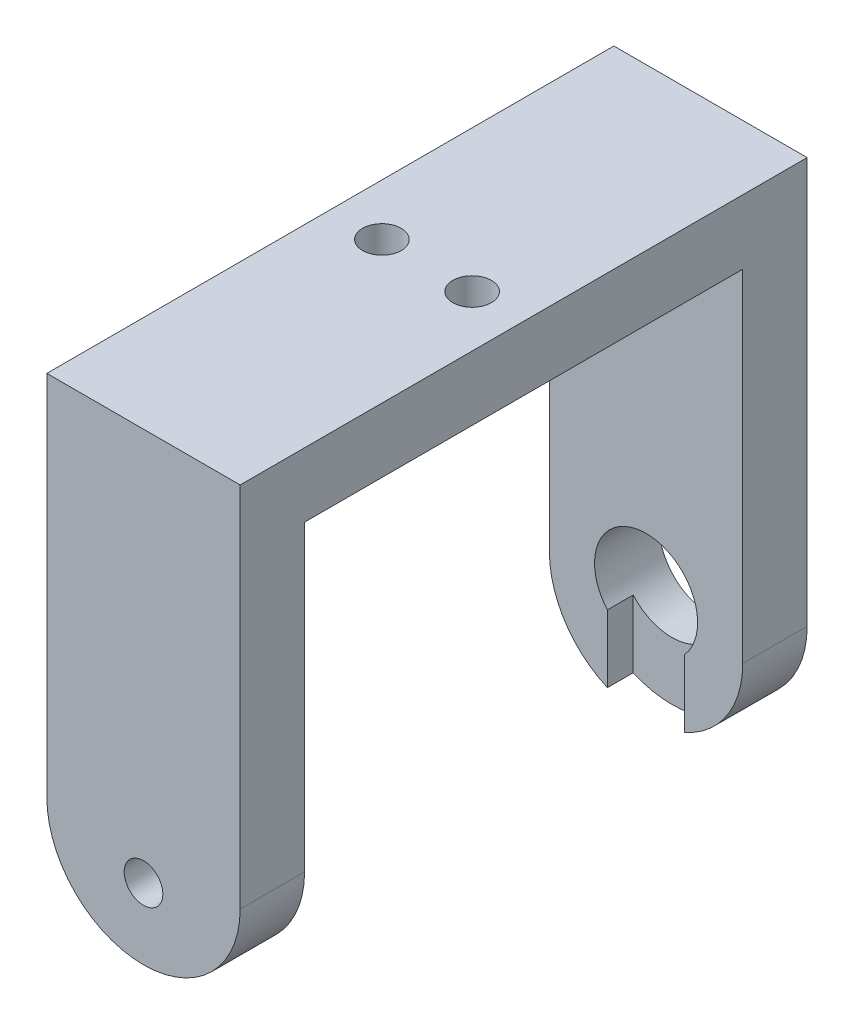
ISO-10303-21;
HEADER;
FILE_DESCRIPTION(('STEP AP214'),'2;1');
FILE_NAME('part.step','',(''),(''),'','','');
FILE_SCHEMA(('AUTOMOTIVE_DESIGN { 1 0 10303 214 1 1 1 1 }'));
ENDSEC;
DATA;
#1=APPLICATION_CONTEXT('core data for automotive mechanical design processes');
#2=APPLICATION_PROTOCOL_DEFINITION('international standard','automotive_design',2000,#1);
#3=PRODUCT_CONTEXT('',#1,'mechanical');
#4=PRODUCT('Part','Part','',(#3));
#5=PRODUCT_RELATED_PRODUCT_CATEGORY('part','',(#4));
#6=PRODUCT_DEFINITION_FORMATION('','',#4);
#7=PRODUCT_DEFINITION_CONTEXT('part definition',#1,'design');
#8=PRODUCT_DEFINITION('design','',#6,#7);
#9=PRODUCT_DEFINITION_SHAPE('','',#8);
#10=(LENGTH_UNIT() NAMED_UNIT(*) SI_UNIT(.MILLI.,.METRE.));
#11=(NAMED_UNIT(*) PLANE_ANGLE_UNIT() SI_UNIT($,.RADIAN.));
#12=(NAMED_UNIT(*) SI_UNIT($,.STERADIAN.) SOLID_ANGLE_UNIT());
#13=UNCERTAINTY_MEASURE_WITH_UNIT(LENGTH_MEASURE(1.E-05),#10,'distance_accuracy_value','');
#14=(GEOMETRIC_REPRESENTATION_CONTEXT(3) GLOBAL_UNCERTAINTY_ASSIGNED_CONTEXT((#13)) GLOBAL_UNIT_ASSIGNED_CONTEXT((#10,
#11,#12)) REPRESENTATION_CONTEXT('',''));
#15=CARTESIAN_POINT('',(0.,0.,0.));
#16=DIRECTION('',(0.,0.,1.));
#17=DIRECTION('',(1.,0.,0.));
#18=AXIS2_PLACEMENT_3D('',#15,#16,#17);
#19=CARTESIAN_POINT('',(-7.5,-5.,-22.));
#20=DIRECTION('',(0.,0.,-1.));
#21=DIRECTION('',(-1.,0.,0.));
#22=AXIS2_PLACEMENT_3D('',#19,#20,#21);
#23=PLANE('',#22);
#24=DIRECTION('',(0.,1.,0.));
#25=VECTOR('',#24,1.);
#26=CARTESIAN_POINT('',(7.5,-5.,-22.));
#27=LINE('',#26,#25);
#28=CARTESIAN_POINT('',(7.5,-31.5,-22.));
#29=VERTEX_POINT('',#28);
#30=CARTESIAN_POINT('',(7.5,0.,-22.));
#31=VERTEX_POINT('',#30);
#32=EDGE_CURVE('E360',#29,#31,#27,.T.);
#33=ORIENTED_EDGE('',*,*,#32,.F.);
#34=CARTESIAN_POINT('',(0.,-31.5,-22.));
#35=DIRECTION('',(0.,0.,-1.));
#36=DIRECTION('',(-1.,0.,0.));
#37=AXIS2_PLACEMENT_3D('',#34,#35,#36);
#38=CIRCLE('',#37,7.5);
#39=CARTESIAN_POINT('',(-7.5,-31.5,-22.));
#40=VERTEX_POINT('',#39);
#41=EDGE_CURVE('E298',#29,#40,#38,.T.);
#42=ORIENTED_EDGE('',*,*,#41,.T.);
#43=DIRECTION('',(0.,1.,0.));
#44=VECTOR('',#43,1.);
#45=CARTESIAN_POINT('',(-7.5,-5.,-22.));
#46=LINE('',#45,#44);
#47=CARTESIAN_POINT('',(-7.5,0.,-22.));
#48=VERTEX_POINT('',#47);
#49=EDGE_CURVE('E374',#40,#48,#46,.T.);
#50=ORIENTED_EDGE('',*,*,#49,.T.);
#51=DIRECTION('',(-1.,0.,0.));
#52=VECTOR('',#51,1.);
#53=CARTESIAN_POINT('',(-7.5,0.,-22.));
#54=LINE('',#53,#52);
#55=EDGE_CURVE('E363',#31,#48,#54,.T.);
#56=ORIENTED_EDGE('',*,*,#55,.F.);
#57=EDGE_LOOP('',(#33,#42,#50,#56));
#58=FACE_BOUND('',#57,.T.);
#59=DIRECTION('',(-1.,0.,0.));
#60=VECTOR('',#59,1.);
#61=CARTESIAN_POINT('',(0.,-10.5,-22.));
#62=LINE('',#61,#60);
#63=CARTESIAN_POINT('',(2.125,-10.5,-22.));
#64=VERTEX_POINT('',#63);
#65=CARTESIAN_POINT('',(-2.125,-10.5,-22.));
#66=VERTEX_POINT('',#65);
#67=EDGE_CURVE('E259',#64,#66,#62,.T.);
#68=ORIENTED_EDGE('',*,*,#67,.T.);
#69=DIRECTION('',(-0.0741895147875681,-0.997244160622455,0.));
#70=VECTOR('',#69,1.);
#71=CARTESIAN_POINT('',(-1.33646068706431,0.0994253702564403,-22.));
#72=LINE('',#71,#70);
#73=CARTESIAN_POINT('',(-3.46410161513776,-28.5,-22.));
#74=VERTEX_POINT('',#73);
#75=EDGE_CURVE('E250',#66,#74,#72,.T.);
#76=ORIENTED_EDGE('',*,*,#75,.T.);
#77=CARTESIAN_POINT('',(0.,-30.5,-22.));
#78=DIRECTION('',(0.,0.,-1.));
#79=DIRECTION('',(-1.,0.,0.));
#80=AXIS2_PLACEMENT_3D('',#77,#78,#79);
#81=CIRCLE('',#80,4.);
#82=CARTESIAN_POINT('',(3.46410161513776,-28.5,-22.));
#83=VERTEX_POINT('',#82);
#84=EDGE_CURVE('E303',#83,#74,#81,.T.);
#85=ORIENTED_EDGE('',*,*,#84,.F.);
#86=DIRECTION('',(0.0741895147875681,-0.997244160622455,0.));
#87=VECTOR('',#86,1.);
#88=CARTESIAN_POINT('',(1.33646068706431,0.0994253702564403,-22.));
#89=LINE('',#88,#87);
#90=EDGE_CURVE('E257',#64,#83,#89,.T.);
#91=ORIENTED_EDGE('',*,*,#90,.F.);
#92=EDGE_LOOP('',(#68,#76,#85,#91));
#93=FACE_BOUND('',#92,.T.);
#94=ADVANCED_FACE('F124',(#58,#93),#23,.T.);
#95=CARTESIAN_POINT('',(0.,-30.5,22.001));
#96=DIRECTION('',(0.,0.,-1.));
#97=DIRECTION('',(-1.,0.,0.));
#98=AXIS2_PLACEMENT_3D('',#95,#96,#97);
#99=CYLINDRICAL_SURFACE('',#98,4.);
#100=CARTESIAN_POINT('',(0.,-30.5,-17.));
#101=DIRECTION('',(0.,0.,-1.));
#102=DIRECTION('',(-1.,0.,0.));
#103=AXIS2_PLACEMENT_3D('',#100,#101,#102);
#104=CIRCLE('',#103,4.);
#105=CARTESIAN_POINT('',(3.,-33.1457513110646,-17.));
#106=VERTEX_POINT('',#105);
#107=CARTESIAN_POINT('',(-3.,-33.1457513110646,-17.));
#108=VERTEX_POINT('',#107);
#109=EDGE_CURVE('E306',#106,#108,#104,.F.);
#110=ORIENTED_EDGE('',*,*,#109,.T.);
#111=DIRECTION('',(0.,0.,1.));
#112=VECTOR('',#111,1.);
#113=CARTESIAN_POINT('',(-3.,-33.1457513110646,-19.));
#114=LINE('',#113,#112);
#115=CARTESIAN_POINT('',(-3.,-33.1457513110646,-19.));
#116=VERTEX_POINT('',#115);
#117=EDGE_CURVE('E281',#116,#108,#114,.T.);
#118=ORIENTED_EDGE('',*,*,#117,.F.);
#119=CARTESIAN_POINT('',(0.,-30.5,-19.));
#120=DIRECTION('',(0.,0.,1.));
#121=DIRECTION('',(1.,0.,0.));
#122=AXIS2_PLACEMENT_3D('',#119,#120,#121);
#123=CIRCLE('',#122,4.);
#124=CARTESIAN_POINT('',(3.,-33.1457513110646,-19.));
#125=VERTEX_POINT('',#124);
#126=EDGE_CURVE('E12',#125,#116,#123,.F.);
#127=ORIENTED_EDGE('',*,*,#126,.F.);
#128=DIRECTION('',(0.,0.,1.));
#129=VECTOR('',#128,1.);
#130=CARTESIAN_POINT('',(3.,-33.1457513110646,-19.));
#131=LINE('',#130,#129);
#132=EDGE_CURVE('E147',#125,#106,#131,.T.);
#133=ORIENTED_EDGE('',*,*,#132,.T.);
#134=EDGE_LOOP('',(#110,#118,#127,#133));
#135=FACE_BOUND('',#134,.T.);
#136=DIRECTION('',(0.,0.,-1.));
#137=VECTOR('',#136,1.);
#138=CARTESIAN_POINT('',(-3.46410161513776,-28.5,-19.));
#139=LINE('',#138,#137);
#140=CARTESIAN_POINT('',(-3.46410161513776,-28.5,-19.));
#141=VERTEX_POINT('',#140);
#142=EDGE_CURVE('E266',#141,#74,#139,.T.);
#143=ORIENTED_EDGE('',*,*,#142,.F.);
#144=CARTESIAN_POINT('',(0.,-30.5,-19.));
#145=DIRECTION('',(0.,0.,-1.));
#146=DIRECTION('',(-1.,0.,0.));
#147=AXIS2_PLACEMENT_3D('',#144,#145,#146);
#148=CIRCLE('',#147,4.);
#149=CARTESIAN_POINT('',(3.46410161513776,-28.5,-19.));
#150=VERTEX_POINT('',#149);
#151=EDGE_CURVE('E252',#150,#141,#148,.F.);
#152=ORIENTED_EDGE('',*,*,#151,.F.);
#153=DIRECTION('',(0.,0.,-1.));
#154=VECTOR('',#153,1.);
#155=CARTESIAN_POINT('',(3.46410161513776,-28.5,-19.));
#156=LINE('',#155,#154);
#157=EDGE_CURVE('E269',#150,#83,#156,.T.);
#158=ORIENTED_EDGE('',*,*,#157,.T.);
#159=ORIENTED_EDGE('',*,*,#84,.T.);
#160=EDGE_LOOP('',(#143,#152,#158,#159));
#161=FACE_BOUND('',#160,.T.);
#162=ADVANCED_FACE('F433',(#135,#161),#99,.F.);
#163=CARTESIAN_POINT('',(7.5,-39.,-17.));
#164=DIRECTION('',(0.,0.,-1.));
#165=DIRECTION('',(-1.,0.,0.));
#166=AXIS2_PLACEMENT_3D('',#163,#164,#165);
#167=PLANE('',#166);
#168=CARTESIAN_POINT('',(0.,-31.5,-17.));
#169=DIRECTION('',(0.,0.,-1.));
#170=DIRECTION('',(-1.,0.,0.));
#171=AXIS2_PLACEMENT_3D('',#168,#169,#170);
#172=CIRCLE('',#171,7.5);
#173=CARTESIAN_POINT('',(-7.5,-31.5,-17.));
#174=VERTEX_POINT('',#173);
#175=CARTESIAN_POINT('',(-3.,-38.3738635424338,-17.));
#176=VERTEX_POINT('',#175);
#177=EDGE_CURVE('E295',#174,#176,#172,.F.);
#178=ORIENTED_EDGE('',*,*,#177,.T.);
#179=DIRECTION('',(0.,-1.,0.));
#180=VECTOR('',#179,1.);
#181=CARTESIAN_POINT('',(-3.,-33.1457513110646,-17.));
#182=LINE('',#181,#180);
#183=EDGE_CURVE('E268',#108,#176,#182,.T.);
#184=ORIENTED_EDGE('',*,*,#183,.F.);
#185=ORIENTED_EDGE('',*,*,#109,.F.);
#186=DIRECTION('',(0.,1.,0.));
#187=VECTOR('',#186,1.);
#188=CARTESIAN_POINT('',(3.,-33.1457513110646,-17.));
#189=LINE('',#188,#187);
#190=CARTESIAN_POINT('',(3.,-38.3738635424338,-17.));
#191=VERTEX_POINT('',#190);
#192=EDGE_CURVE('E277',#191,#106,#189,.T.);
#193=ORIENTED_EDGE('',*,*,#192,.F.);
#194=CARTESIAN_POINT('',(7.5,-31.5,-17.));
#195=VERTEX_POINT('',#194);
#196=EDGE_CURVE('E294',#191,#195,#172,.F.);
#197=ORIENTED_EDGE('',*,*,#196,.T.);
#198=DIRECTION('',(0.,1.,0.));
#199=VECTOR('',#198,1.);
#200=CARTESIAN_POINT('',(7.5,-39.,-17.));
#201=LINE('',#200,#199);
#202=CARTESIAN_POINT('',(7.5,-5.,-17.));
#203=VERTEX_POINT('',#202);
#204=EDGE_CURVE('E336',#195,#203,#201,.T.);
#205=ORIENTED_EDGE('',*,*,#204,.T.);
#206=DIRECTION('',(-1.,0.,0.));
#207=VECTOR('',#206,1.);
#208=CARTESIAN_POINT('',(7.5,-5.,-17.));
#209=LINE('',#208,#207);
#210=CARTESIAN_POINT('',(-7.5,-5.,-17.));
#211=VERTEX_POINT('',#210);
#212=EDGE_CURVE('E333',#203,#211,#209,.T.);
#213=ORIENTED_EDGE('',*,*,#212,.T.);
#214=DIRECTION('',(0.,1.,0.));
#215=VECTOR('',#214,1.);
#216=CARTESIAN_POINT('',(-7.5,-39.,-17.));
#217=LINE('',#216,#215);
#218=EDGE_CURVE('E338',#174,#211,#217,.T.);
#219=ORIENTED_EDGE('',*,*,#218,.F.);
#220=EDGE_LOOP('',(#178,#184,#185,#193,#197,#205,#213,#219));
#221=FACE_BOUND('',#220,.T.);
#222=ADVANCED_FACE('F405',(#221),#167,.F.);
#223=CARTESIAN_POINT('',(7.5,-5.,22.));
#224=DIRECTION('',(1.,0.,0.));
#225=DIRECTION('',(0.,0.,-1.));
#226=AXIS2_PLACEMENT_3D('',#223,#224,#225);
#227=PLANE('',#226);
#228=ORIENTED_EDGE('',*,*,#204,.F.);
#229=DIRECTION('',(0.,0.,-1.));
#230=VECTOR('',#229,1.);
#231=CARTESIAN_POINT('',(7.5,-31.5,22.001));
#232=LINE('',#231,#230);
#233=EDGE_CURVE('E291',#195,#29,#232,.T.);
#234=ORIENTED_EDGE('',*,*,#233,.T.);
#235=ORIENTED_EDGE('',*,*,#32,.T.);
#236=DIRECTION('',(0.,0.,-1.));
#237=VECTOR('',#236,1.);
#238=CARTESIAN_POINT('',(7.5,0.,22.));
#239=LINE('',#238,#237);
#240=CARTESIAN_POINT('',(7.5,0.,22.));
#241=VERTEX_POINT('',#240);
#242=EDGE_CURVE('E350',#241,#31,#239,.T.);
#243=ORIENTED_EDGE('',*,*,#242,.F.);
#244=DIRECTION('',(0.,1.,0.));
#245=VECTOR('',#244,1.);
#246=CARTESIAN_POINT('',(7.5,-5.,22.));
#247=LINE('',#246,#245);
#248=CARTESIAN_POINT('',(7.5,-28.5,22.));
#249=VERTEX_POINT('',#248);
#250=EDGE_CURVE('E132',#249,#241,#247,.T.);
#251=ORIENTED_EDGE('',*,*,#250,.F.);
#252=DIRECTION('',(0.,0.,1.));
#253=VECTOR('',#252,1.);
#254=CARTESIAN_POINT('',(7.5,-28.5,-22.001));
#255=LINE('',#254,#253);
#256=CARTESIAN_POINT('',(7.5,-28.5,17.));
#257=VERTEX_POINT('',#256);
#258=EDGE_CURVE('E309',#257,#249,#255,.T.);
#259=ORIENTED_EDGE('',*,*,#258,.F.);
#260=DIRECTION('',(0.,1.,0.));
#261=VECTOR('',#260,1.);
#262=CARTESIAN_POINT('',(7.5,-36.,17.));
#263=LINE('',#262,#261);
#264=CARTESIAN_POINT('',(7.5,-5.,17.));
#265=VERTEX_POINT('',#264);
#266=EDGE_CURVE('E329',#257,#265,#263,.T.);
#267=ORIENTED_EDGE('',*,*,#266,.T.);
#268=DIRECTION('',(0.,0.,-1.));
#269=VECTOR('',#268,1.);
#270=CARTESIAN_POINT('',(7.5,-5.,22.));
#271=LINE('',#270,#269);
#272=EDGE_CURVE('E353',#265,#203,#271,.T.);
#273=ORIENTED_EDGE('',*,*,#272,.T.);
#274=EDGE_LOOP('',(#228,#234,#235,#243,#251,#259,#267,#273));
#275=FACE_BOUND('',#274,.T.);
#276=ADVANCED_FACE('F126',(#275),#227,.T.);
#277=CARTESIAN_POINT('',(-7.5,-5.,22.));
#278=DIRECTION('',(0.,0.,1.));
#279=DIRECTION('',(1.,0.,0.));
#280=AXIS2_PLACEMENT_3D('',#277,#278,#279);
#281=PLANE('',#280);
#282=CARTESIAN_POINT('',(0.,-30.5,22.));
#283=DIRECTION('',(0.,0.,1.));
#284=DIRECTION('',(1.,0.,0.));
#285=AXIS2_PLACEMENT_3D('',#282,#283,#284);
#286=CIRCLE('',#285,1.5);
#287=CARTESIAN_POINT('',(1.5,-30.5,22.));
#288=VERTEX_POINT('',#287);
#289=EDGE_CURVE('E323',#288,#288,#286,.T.);
#290=ORIENTED_EDGE('',*,*,#289,.F.);
#291=EDGE_LOOP('',(#290));
#292=FACE_BOUND('',#291,.T.);
#293=CARTESIAN_POINT('',(0.,-28.5,22.));
#294=DIRECTION('',(0.,0.,1.));
#295=DIRECTION('',(1.,0.,0.));
#296=AXIS2_PLACEMENT_3D('',#293,#294,#295);
#297=CIRCLE('',#296,7.5);
#298=CARTESIAN_POINT('',(-7.5,-28.5,22.));
#299=VERTEX_POINT('',#298);
#300=EDGE_CURVE('E313',#299,#249,#297,.T.);
#301=ORIENTED_EDGE('',*,*,#300,.T.);
#302=ORIENTED_EDGE('',*,*,#250,.T.);
#303=DIRECTION('',(1.,0.,0.));
#304=VECTOR('',#303,1.);
#305=CARTESIAN_POINT('',(-7.5,0.,22.));
#306=LINE('',#305,#304);
#307=CARTESIAN_POINT('',(-7.5,0.,22.));
#308=VERTEX_POINT('',#307);
#309=EDGE_CURVE('E357',#308,#241,#306,.T.);
#310=ORIENTED_EDGE('',*,*,#309,.F.);
#311=DIRECTION('',(0.,1.,0.));
#312=VECTOR('',#311,1.);
#313=CARTESIAN_POINT('',(-7.5,-5.,22.));
#314=LINE('',#313,#312);
#315=EDGE_CURVE('E372',#299,#308,#314,.T.);
#316=ORIENTED_EDGE('',*,*,#315,.F.);
#317=EDGE_LOOP('',(#301,#302,#310,#316));
#318=FACE_BOUND('',#317,.T.);
#319=ADVANCED_FACE('F391',(#292,#318),#281,.T.);
#320=CARTESIAN_POINT('',(0.,-36.,17.));
#321=DIRECTION('',(0.,0.,1.));
#322=DIRECTION('',(1.,0.,0.));
#323=AXIS2_PLACEMENT_3D('',#320,#321,#322);
#324=PLANE('',#323);
#325=CARTESIAN_POINT('',(0.,-30.5,17.));
#326=DIRECTION('',(0.,0.,1.));
#327=DIRECTION('',(1.,0.,0.));
#328=AXIS2_PLACEMENT_3D('',#325,#326,#327);
#329=CIRCLE('',#328,1.5);
#330=CARTESIAN_POINT('',(1.5,-30.5,17.));
#331=VERTEX_POINT('',#330);
#332=EDGE_CURVE('E315',#331,#331,#329,.F.);
#333=ORIENTED_EDGE('',*,*,#332,.F.);
#334=EDGE_LOOP('',(#333));
#335=FACE_BOUND('',#334,.T.);
#336=ORIENTED_EDGE('',*,*,#266,.F.);
#337=CARTESIAN_POINT('',(0.,-28.5,17.));
#338=DIRECTION('',(0.,0.,1.));
#339=DIRECTION('',(1.,0.,0.));
#340=AXIS2_PLACEMENT_3D('',#337,#338,#339);
#341=CIRCLE('',#340,7.5);
#342=CARTESIAN_POINT('',(-7.5,-28.5,17.));
#343=VERTEX_POINT('',#342);
#344=EDGE_CURVE('E312',#257,#343,#341,.F.);
#345=ORIENTED_EDGE('',*,*,#344,.T.);
#346=DIRECTION('',(0.,1.,0.));
#347=VECTOR('',#346,1.);
#348=CARTESIAN_POINT('',(-7.5,-36.,17.));
#349=LINE('',#348,#347);
#350=CARTESIAN_POINT('',(-7.5,-5.,17.));
#351=VERTEX_POINT('',#350);
#352=EDGE_CURVE('E331',#343,#351,#349,.T.);
#353=ORIENTED_EDGE('',*,*,#352,.T.);
#354=DIRECTION('',(1.,0.,0.));
#355=VECTOR('',#354,1.);
#356=CARTESIAN_POINT('',(0.,-5.,17.));
#357=LINE('',#356,#355);
#358=EDGE_CURVE('E326',#351,#265,#357,.T.);
#359=ORIENTED_EDGE('',*,*,#358,.T.);
#360=EDGE_LOOP('',(#336,#345,#353,#359));
#361=FACE_BOUND('',#360,.T.);
#362=ADVANCED_FACE('F396',(#335,#361),#324,.F.);
#363=CARTESIAN_POINT('',(-7.5,-5.,22.));
#364=DIRECTION('',(-1.,0.,0.));
#365=DIRECTION('',(0.,0.,1.));
#366=AXIS2_PLACEMENT_3D('',#363,#364,#365);
#367=PLANE('',#366);
#368=DIRECTION('',(0.,0.,-1.));
#369=VECTOR('',#368,1.);
#370=CARTESIAN_POINT('',(-7.5,-31.5,22.001));
#371=LINE('',#370,#369);
#372=EDGE_CURVE('E301',#174,#40,#371,.T.);
#373=ORIENTED_EDGE('',*,*,#372,.F.);
#374=ORIENTED_EDGE('',*,*,#218,.T.);
#375=DIRECTION('',(0.,0.,1.));
#376=VECTOR('',#375,1.);
#377=CARTESIAN_POINT('',(-7.5,-5.,22.));
#378=LINE('',#377,#376);
#379=EDGE_CURVE('E356',#211,#351,#378,.T.);
#380=ORIENTED_EDGE('',*,*,#379,.T.);
#381=ORIENTED_EDGE('',*,*,#352,.F.);
#382=DIRECTION('',(0.,0.,1.));
#383=VECTOR('',#382,1.);
#384=CARTESIAN_POINT('',(-7.5,-28.5,-22.001));
#385=LINE('',#384,#383);
#386=EDGE_CURVE('E316',#343,#299,#385,.T.);
#387=ORIENTED_EDGE('',*,*,#386,.T.);
#388=ORIENTED_EDGE('',*,*,#315,.T.);
#389=DIRECTION('',(0.,0.,1.));
#390=VECTOR('',#389,1.);
#391=CARTESIAN_POINT('',(-7.5,0.,22.));
#392=LINE('',#391,#390);
#393=EDGE_CURVE('E366',#48,#308,#392,.T.);
#394=ORIENTED_EDGE('',*,*,#393,.F.);
#395=ORIENTED_EDGE('',*,*,#49,.F.);
#396=EDGE_LOOP('',(#373,#374,#380,#381,#387,#388,#394,#395));
#397=FACE_BOUND('',#396,.T.);
#398=ADVANCED_FACE('F416',(#397),#367,.T.);
#399=CARTESIAN_POINT('',(0.,-5.,0.));
#400=DIRECTION('',(0.,-1.,0.));
#401=DIRECTION('',(0.,0.,-1.));
#402=AXIS2_PLACEMENT_3D('',#399,#400,#401);
#403=PLANE('',#402);
#404=CARTESIAN_POINT('',(-3.5,-5.,0.));
#405=DIRECTION('',(0.,1.,0.));
#406=DIRECTION('',(0.,0.,1.));
#407=AXIS2_PLACEMENT_3D('',#404,#405,#406);
#408=CIRCLE('',#407,1.5);
#409=CARTESIAN_POINT('',(-3.5,-5.,1.5));
#410=VERTEX_POINT('',#409);
#411=EDGE_CURVE('E341',#410,#410,#408,.T.);
#412=ORIENTED_EDGE('',*,*,#411,.T.);
#413=EDGE_LOOP('',(#412));
#414=FACE_BOUND('',#413,.T.);
#415=CARTESIAN_POINT('',(3.5,-5.,0.));
#416=DIRECTION('',(0.,1.,0.));
#417=DIRECTION('',(0.,0.,1.));
#418=AXIS2_PLACEMENT_3D('',#415,#416,#417);
#419=CIRCLE('',#418,1.5);
#420=CARTESIAN_POINT('',(3.5,-5.,1.5));
#421=VERTEX_POINT('',#420);
#422=EDGE_CURVE('E347',#421,#421,#419,.T.);
#423=ORIENTED_EDGE('',*,*,#422,.T.);
#424=EDGE_LOOP('',(#423));
#425=FACE_BOUND('',#424,.T.);
#426=ORIENTED_EDGE('',*,*,#272,.F.);
#427=ORIENTED_EDGE('',*,*,#358,.F.);
#428=ORIENTED_EDGE('',*,*,#379,.F.);
#429=ORIENTED_EDGE('',*,*,#212,.F.);
#430=EDGE_LOOP('',(#426,#427,#428,#429));
#431=FACE_BOUND('',#430,.T.);
#432=ADVANCED_FACE('F403',(#414,#425,#431),#403,.T.);
#433=CARTESIAN_POINT('',(0.,0.,0.));
#434=DIRECTION('',(0.,-1.,0.));
#435=DIRECTION('',(0.,0.,-1.));
#436=AXIS2_PLACEMENT_3D('',#433,#434,#435);
#437=PLANE('',#436);
#438=CARTESIAN_POINT('',(-3.5,0.,0.));
#439=DIRECTION('',(0.,1.,0.));
#440=DIRECTION('',(0.,0.,1.));
#441=AXIS2_PLACEMENT_3D('',#438,#439,#440);
#442=CIRCLE('',#441,1.5);
#443=CARTESIAN_POINT('',(-3.5,0.,1.5));
#444=VERTEX_POINT('',#443);
#445=EDGE_CURVE('E340',#444,#444,#442,.T.);
#446=ORIENTED_EDGE('',*,*,#445,.F.);
#447=EDGE_LOOP('',(#446));
#448=FACE_BOUND('',#447,.T.);
#449=CARTESIAN_POINT('',(3.5,0.,0.));
#450=DIRECTION('',(0.,1.,0.));
#451=DIRECTION('',(0.,0.,1.));
#452=AXIS2_PLACEMENT_3D('',#449,#450,#451);
#453=CIRCLE('',#452,1.5);
#454=CARTESIAN_POINT('',(3.5,0.,1.5));
#455=VERTEX_POINT('',#454);
#456=EDGE_CURVE('E344',#455,#455,#453,.T.);
#457=ORIENTED_EDGE('',*,*,#456,.F.);
#458=EDGE_LOOP('',(#457));
#459=FACE_BOUND('',#458,.T.);
#460=ORIENTED_EDGE('',*,*,#242,.T.);
#461=ORIENTED_EDGE('',*,*,#55,.T.);
#462=ORIENTED_EDGE('',*,*,#393,.T.);
#463=ORIENTED_EDGE('',*,*,#309,.T.);
#464=EDGE_LOOP('',(#460,#461,#462,#463));
#465=FACE_BOUND('',#464,.T.);
#466=ADVANCED_FACE('F387',(#448,#459,#465),#437,.F.);
#467=CARTESIAN_POINT('',(3.5,-5.,0.));
#468=DIRECTION('',(0.,1.,0.));
#469=DIRECTION('',(0.,0.,1.));
#470=AXIS2_PLACEMENT_3D('',#467,#468,#469);
#471=CYLINDRICAL_SURFACE('',#470,1.5);
#472=ORIENTED_EDGE('',*,*,#422,.F.);
#473=EDGE_LOOP('',(#472));
#474=FACE_BOUND('',#473,.T.);
#475=ORIENTED_EDGE('',*,*,#456,.T.);
#476=EDGE_LOOP('',(#475));
#477=FACE_BOUND('',#476,.T.);
#478=ADVANCED_FACE('F428',(#474,#477),#471,.F.);
#479=CARTESIAN_POINT('',(-3.5,-5.,0.));
#480=DIRECTION('',(0.,1.,0.));
#481=DIRECTION('',(0.,0.,1.));
#482=AXIS2_PLACEMENT_3D('',#479,#480,#481);
#483=CYLINDRICAL_SURFACE('',#482,1.5);
#484=ORIENTED_EDGE('',*,*,#411,.F.);
#485=EDGE_LOOP('',(#484));
#486=FACE_BOUND('',#485,.T.);
#487=ORIENTED_EDGE('',*,*,#445,.T.);
#488=EDGE_LOOP('',(#487));
#489=FACE_BOUND('',#488,.T.);
#490=ADVANCED_FACE('F420',(#486,#489),#483,.F.);
#491=CARTESIAN_POINT('',(0.,-28.5,-22.001));
#492=DIRECTION('',(0.,0.,1.));
#493=DIRECTION('',(1.,0.,0.));
#494=AXIS2_PLACEMENT_3D('',#491,#492,#493);
#495=CYLINDRICAL_SURFACE('',#494,7.5);
#496=ORIENTED_EDGE('',*,*,#344,.F.);
#497=ORIENTED_EDGE('',*,*,#258,.T.);
#498=ORIENTED_EDGE('',*,*,#300,.F.);
#499=ORIENTED_EDGE('',*,*,#386,.F.);
#500=EDGE_LOOP('',(#496,#497,#498,#499));
#501=FACE_BOUND('',#500,.T.);
#502=ADVANCED_FACE('F417',(#501),#495,.T.);
#503=CARTESIAN_POINT('',(0.,-30.5,-22.001));
#504=DIRECTION('',(0.,0.,1.));
#505=DIRECTION('',(1.,0.,0.));
#506=AXIS2_PLACEMENT_3D('',#503,#504,#505);
#507=CYLINDRICAL_SURFACE('',#506,1.5);
#508=ORIENTED_EDGE('',*,*,#289,.T.);
#509=EDGE_LOOP('',(#508));
#510=FACE_BOUND('',#509,.T.);
#511=ORIENTED_EDGE('',*,*,#332,.T.);
#512=EDGE_LOOP('',(#511));
#513=FACE_BOUND('',#512,.T.);
#514=ADVANCED_FACE('F419',(#510,#513),#507,.F.);
#515=CARTESIAN_POINT('',(0.,-31.5,22.001));
#516=DIRECTION('',(0.,0.,-1.));
#517=DIRECTION('',(-1.,0.,0.));
#518=AXIS2_PLACEMENT_3D('',#515,#516,#517);
#519=CYLINDRICAL_SURFACE('',#518,7.5);
#520=DIRECTION('',(0.,0.,-1.));
#521=VECTOR('',#520,1.);
#522=CARTESIAN_POINT('',(-3.,-38.3738635424338,22.001));
#523=LINE('',#522,#521);
#524=CARTESIAN_POINT('',(-3.,-38.3738635424338,-19.));
#525=VERTEX_POINT('',#524);
#526=EDGE_CURVE('E288',#176,#525,#523,.T.);
#527=ORIENTED_EDGE('',*,*,#526,.F.);
#528=ORIENTED_EDGE('',*,*,#177,.F.);
#529=ORIENTED_EDGE('',*,*,#372,.T.);
#530=ORIENTED_EDGE('',*,*,#41,.F.);
#531=ORIENTED_EDGE('',*,*,#233,.F.);
#532=ORIENTED_EDGE('',*,*,#196,.F.);
#533=DIRECTION('',(0.,0.,-1.));
#534=VECTOR('',#533,1.);
#535=CARTESIAN_POINT('',(3.,-38.3738635424338,22.001));
#536=LINE('',#535,#534);
#537=CARTESIAN_POINT('',(3.,-38.3738635424338,-19.));
#538=VERTEX_POINT('',#537);
#539=EDGE_CURVE('E286',#538,#191,#536,.F.);
#540=ORIENTED_EDGE('',*,*,#539,.F.);
#541=CARTESIAN_POINT('',(0.,-31.5,-19.));
#542=DIRECTION('',(0.,0.,1.));
#543=DIRECTION('',(1.,0.,0.));
#544=AXIS2_PLACEMENT_3D('',#541,#542,#543);
#545=CIRCLE('',#544,7.5);
#546=EDGE_CURVE('E283',#538,#525,#545,.F.);
#547=ORIENTED_EDGE('',*,*,#546,.T.);
#548=EDGE_LOOP('',(#527,#528,#529,#530,#531,#532,#540,#547));
#549=FACE_BOUND('',#548,.T.);
#550=ADVANCED_FACE('F413',(#549),#519,.T.);
#551=CARTESIAN_POINT('',(0.,0.,-19.));
#552=DIRECTION('',(0.,0.,1.));
#553=DIRECTION('',(1.,0.,0.));
#554=AXIS2_PLACEMENT_3D('',#551,#552,#553);
#555=PLANE('',#554);
#556=DIRECTION('',(0.,1.,0.));
#557=VECTOR('',#556,1.);
#558=CARTESIAN_POINT('',(3.,-33.1457513110646,-19.));
#559=LINE('',#558,#557);
#560=EDGE_CURVE('E276',#538,#125,#559,.T.);
#561=ORIENTED_EDGE('',*,*,#560,.T.);
#562=ORIENTED_EDGE('',*,*,#126,.T.);
#563=DIRECTION('',(0.,-1.,0.));
#564=VECTOR('',#563,1.);
#565=CARTESIAN_POINT('',(-3.,-33.1457513110646,-19.));
#566=LINE('',#565,#564);
#567=EDGE_CURVE('E273',#116,#525,#566,.T.);
#568=ORIENTED_EDGE('',*,*,#567,.T.);
#569=ORIENTED_EDGE('',*,*,#546,.F.);
#570=EDGE_LOOP('',(#561,#562,#568,#569));
#571=FACE_BOUND('',#570,.T.);
#572=ADVANCED_FACE('F552',(#571),#555,.T.);
#573=CARTESIAN_POINT('',(-3.,-33.1457513110646,-19.));
#574=DIRECTION('',(-1.,0.,0.));
#575=DIRECTION('',(0.,-1.,0.));
#576=AXIS2_PLACEMENT_3D('',#573,#574,#575);
#577=PLANE('',#576);
#578=ORIENTED_EDGE('',*,*,#526,.T.);
#579=ORIENTED_EDGE('',*,*,#567,.F.);
#580=ORIENTED_EDGE('',*,*,#117,.T.);
#581=ORIENTED_EDGE('',*,*,#183,.T.);
#582=EDGE_LOOP('',(#578,#579,#580,#581));
#583=FACE_BOUND('',#582,.T.);
#584=ADVANCED_FACE('F563',(#583),#577,.F.);
#585=CARTESIAN_POINT('',(3.,-33.1457513110646,-19.));
#586=DIRECTION('',(1.,0.,0.));
#587=DIRECTION('',(0.,1.,0.));
#588=AXIS2_PLACEMENT_3D('',#585,#586,#587);
#589=PLANE('',#588);
#590=ORIENTED_EDGE('',*,*,#539,.T.);
#591=ORIENTED_EDGE('',*,*,#192,.T.);
#592=ORIENTED_EDGE('',*,*,#132,.F.);
#593=ORIENTED_EDGE('',*,*,#560,.F.);
#594=EDGE_LOOP('',(#590,#591,#592,#593));
#595=FACE_BOUND('',#594,.T.);
#596=ADVANCED_FACE('F572',(#595),#589,.F.);
#597=CARTESIAN_POINT('',(-1.33646068706431,0.0994253702564403,-19.));
#598=DIRECTION('',(0.997244160622455,-0.0741895147875681,0.));
#599=DIRECTION('',(0.0741895147875681,0.997244160622455,0.));
#600=AXIS2_PLACEMENT_3D('',#597,#598,#599);
#601=PLANE('',#600);
#602=ORIENTED_EDGE('',*,*,#75,.F.);
#603=DIRECTION('',(0.,0.,-1.));
#604=VECTOR('',#603,1.);
#605=CARTESIAN_POINT('',(-2.125,-10.5,-19.));
#606=LINE('',#605,#604);
#607=CARTESIAN_POINT('',(-2.125,-10.5,-19.));
#608=VERTEX_POINT('',#607);
#609=EDGE_CURVE('E241',#608,#66,#606,.T.);
#610=ORIENTED_EDGE('',*,*,#609,.F.);
#611=DIRECTION('',(-0.0741895147875681,-0.997244160622455,0.));
#612=VECTOR('',#611,1.);
#613=CARTESIAN_POINT('',(-1.33646068706431,0.0994253702564403,-19.));
#614=LINE('',#613,#612);
#615=EDGE_CURVE('E245',#608,#141,#614,.T.);
#616=ORIENTED_EDGE('',*,*,#615,.T.);
#617=ORIENTED_EDGE('',*,*,#142,.T.);
#618=EDGE_LOOP('',(#602,#610,#616,#617));
#619=FACE_BOUND('',#618,.T.);
#620=ADVANCED_FACE('F248',(#619),#601,.T.);
#621=CARTESIAN_POINT('',(1.33646068706431,0.0994253702564403,-19.));
#622=DIRECTION('',(0.997244160622455,0.0741895147875681,0.));
#623=DIRECTION('',(-0.0741895147875681,0.997244160622455,0.));
#624=AXIS2_PLACEMENT_3D('',#621,#622,#623);
#625=PLANE('',#624);
#626=ORIENTED_EDGE('',*,*,#90,.T.);
#627=ORIENTED_EDGE('',*,*,#157,.F.);
#628=DIRECTION('',(0.0741895147875681,-0.997244160622455,0.));
#629=VECTOR('',#628,1.);
#630=CARTESIAN_POINT('',(1.33646068706431,0.0994253702564403,-19.));
#631=LINE('',#630,#629);
#632=CARTESIAN_POINT('',(2.125,-10.5,-19.));
#633=VERTEX_POINT('',#632);
#634=EDGE_CURVE('E139',#633,#150,#631,.T.);
#635=ORIENTED_EDGE('',*,*,#634,.F.);
#636=DIRECTION('',(0.,0.,-1.));
#637=VECTOR('',#636,1.);
#638=CARTESIAN_POINT('',(2.125,-10.5,-19.));
#639=LINE('',#638,#637);
#640=EDGE_CURVE('E243',#633,#64,#639,.T.);
#641=ORIENTED_EDGE('',*,*,#640,.T.);
#642=EDGE_LOOP('',(#626,#627,#635,#641));
#643=FACE_BOUND('',#642,.T.);
#644=ADVANCED_FACE('F600',(#643),#625,.F.);
#645=CARTESIAN_POINT('',(0.,-10.5,-19.));
#646=DIRECTION('',(0.,-1.,0.));
#647=DIRECTION('',(0.,0.,-1.));
#648=AXIS2_PLACEMENT_3D('',#645,#646,#647);
#649=PLANE('',#648);
#650=ORIENTED_EDGE('',*,*,#67,.F.);
#651=ORIENTED_EDGE('',*,*,#640,.F.);
#652=DIRECTION('',(-1.,0.,0.));
#653=VECTOR('',#652,1.);
#654=CARTESIAN_POINT('',(0.,-10.5,-19.));
#655=LINE('',#654,#653);
#656=EDGE_CURVE('E237',#633,#608,#655,.T.);
#657=ORIENTED_EDGE('',*,*,#656,.T.);
#658=ORIENTED_EDGE('',*,*,#609,.T.);
#659=EDGE_LOOP('',(#650,#651,#657,#658));
#660=FACE_BOUND('',#659,.T.);
#661=ADVANCED_FACE('F240',(#660),#649,.T.);
#662=CARTESIAN_POINT('',(0.,0.,-19.));
#663=DIRECTION('',(0.,0.,-1.));
#664=DIRECTION('',(-1.,0.,0.));
#665=AXIS2_PLACEMENT_3D('',#662,#663,#664);
#666=PLANE('',#665);
#667=ORIENTED_EDGE('',*,*,#615,.F.);
#668=ORIENTED_EDGE('',*,*,#656,.F.);
#669=ORIENTED_EDGE('',*,*,#634,.T.);
#670=ORIENTED_EDGE('',*,*,#151,.T.);
#671=EDGE_LOOP('',(#667,#668,#669,#670));
#672=FACE_BOUND('',#671,.T.);
#673=ADVANCED_FACE('F254',(#672),#666,.T.);
#674=CLOSED_SHELL('',(#94,#162,#222,#276,#319,#362,#398,#432,#466,#478,#490,#502,#514,#550,#572,
#584,#596,#620,#644,#661,#673));
#675=MANIFOLD_SOLID_BREP('B2',#674);
#676=ADVANCED_BREP_SHAPE_REPRESENTATION('',(#18,#675),#14);
#677=SHAPE_DEFINITION_REPRESENTATION(#9,#676);
ENDSEC;
END-ISO-10303-21;
